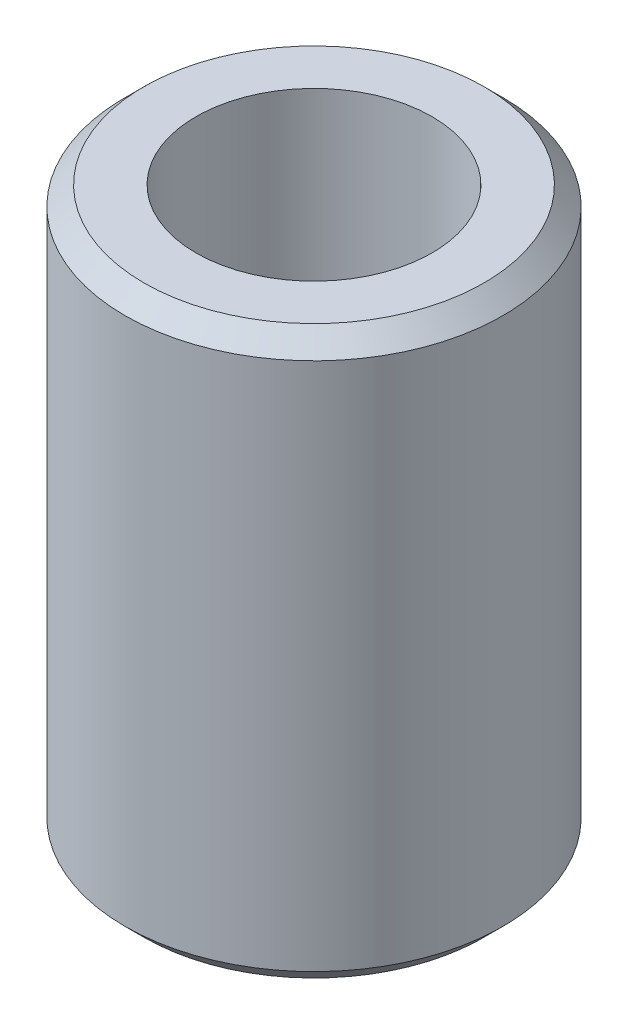
ISO-10303-21;
HEADER;
FILE_DESCRIPTION(('STEP AP214'),'2;1');
FILE_NAME('part.step','',(''),(''),'','','');
FILE_SCHEMA(('AUTOMOTIVE_DESIGN { 1 0 10303 214 1 1 1 1 }'));
ENDSEC;
DATA;
#1=APPLICATION_CONTEXT('core data for automotive mechanical design processes');
#2=APPLICATION_PROTOCOL_DEFINITION('international standard','automotive_design',2000,#1);
#3=PRODUCT_CONTEXT('',#1,'mechanical');
#4=PRODUCT('Part','Part','',(#3));
#5=PRODUCT_RELATED_PRODUCT_CATEGORY('part','',(#4));
#6=PRODUCT_DEFINITION_FORMATION('','',#4);
#7=PRODUCT_DEFINITION_CONTEXT('part definition',#1,'design');
#8=PRODUCT_DEFINITION('design','',#6,#7);
#9=PRODUCT_DEFINITION_SHAPE('','',#8);
#10=(LENGTH_UNIT() NAMED_UNIT(*) SI_UNIT(.MILLI.,.METRE.));
#11=(NAMED_UNIT(*) PLANE_ANGLE_UNIT() SI_UNIT($,.RADIAN.));
#12=(NAMED_UNIT(*) SI_UNIT($,.STERADIAN.) SOLID_ANGLE_UNIT());
#13=UNCERTAINTY_MEASURE_WITH_UNIT(LENGTH_MEASURE(1.E-05),#10,'distance_accuracy_value','');
#14=(GEOMETRIC_REPRESENTATION_CONTEXT(3) GLOBAL_UNCERTAINTY_ASSIGNED_CONTEXT((#13)) GLOBAL_UNIT_ASSIGNED_CONTEXT((#10,
#11,#12)) REPRESENTATION_CONTEXT('',''));
#15=CARTESIAN_POINT('',(0.,0.,0.));
#16=DIRECTION('',(0.,0.,1.));
#17=DIRECTION('',(1.,0.,0.));
#18=AXIS2_PLACEMENT_3D('',#15,#16,#17);
#19=CARTESIAN_POINT('',(0.,30.,0.));
#20=DIRECTION('',(0.,1.,0.));
#21=DIRECTION('',(0.,0.,1.));
#22=AXIS2_PLACEMENT_3D('',#19,#20,#21);
#23=PLANE('',#22);
#24=CARTESIAN_POINT('',(0.,30.,0.));
#25=DIRECTION('',(0.,1.,0.));
#26=DIRECTION('',(0.,0.,1.));
#27=AXIS2_PLACEMENT_3D('',#24,#25,#26);
#28=CIRCLE('',#27,18.);
#29=CARTESIAN_POINT('',(0.,30.,18.));
#30=VERTEX_POINT('',#29);
#31=EDGE_CURVE('E10',#30,#30,#28,.T.);
#32=ORIENTED_EDGE('',*,*,#31,.T.);
#33=EDGE_LOOP('',(#32));
#34=FACE_BOUND('',#33,.T.);
#35=CARTESIAN_POINT('',(0.,30.,0.));
#36=DIRECTION('',(0.,1.,0.));
#37=DIRECTION('',(0.,0.,1.));
#38=AXIS2_PLACEMENT_3D('',#35,#36,#37);
#39=CIRCLE('',#38,12.5);
#40=CARTESIAN_POINT('',(0.,30.,12.5));
#41=VERTEX_POINT('',#40);
#42=EDGE_CURVE('E58',#41,#41,#39,.T.);
#43=ORIENTED_EDGE('',*,*,#42,.F.);
#44=EDGE_LOOP('',(#43));
#45=FACE_BOUND('',#44,.T.);
#46=ADVANCED_FACE('F37',(#34,#45),#23,.T.);
#47=CARTESIAN_POINT('',(0.,-30.,0.));
#48=DIRECTION('',(0.,1.,0.));
#49=DIRECTION('',(0.,0.,1.));
#50=AXIS2_PLACEMENT_3D('',#47,#48,#49);
#51=PLANE('',#50);
#52=CARTESIAN_POINT('',(0.,-30.,0.));
#53=DIRECTION('',(0.,1.,0.));
#54=DIRECTION('',(0.,0.,1.));
#55=AXIS2_PLACEMENT_3D('',#52,#53,#54);
#56=CIRCLE('',#55,18.);
#57=CARTESIAN_POINT('',(0.,-30.,18.));
#58=VERTEX_POINT('',#57);
#59=EDGE_CURVE('E45',#58,#58,#56,.F.);
#60=ORIENTED_EDGE('',*,*,#59,.T.);
#61=EDGE_LOOP('',(#60));
#62=FACE_BOUND('',#61,.T.);
#63=CARTESIAN_POINT('',(0.,-30.,0.));
#64=DIRECTION('',(0.,1.,0.));
#65=DIRECTION('',(0.,0.,1.));
#66=AXIS2_PLACEMENT_3D('',#63,#64,#65);
#67=CIRCLE('',#66,12.5);
#68=CARTESIAN_POINT('',(0.,-30.,12.5));
#69=VERTEX_POINT('',#68);
#70=EDGE_CURVE('E59',#69,#69,#67,.T.);
#71=ORIENTED_EDGE('',*,*,#70,.T.);
#72=EDGE_LOOP('',(#71));
#73=FACE_BOUND('',#72,.T.);
#74=ADVANCED_FACE('F69',(#62,#73),#51,.F.);
#75=CARTESIAN_POINT('',(0.,30.,0.));
#76=DIRECTION('',(0.,-1.,0.));
#77=DIRECTION('',(0.,0.,-1.));
#78=AXIS2_PLACEMENT_3D('',#75,#76,#77);
#79=CYLINDRICAL_SURFACE('',#78,20.);
#80=CARTESIAN_POINT('',(0.,-28.,0.));
#81=DIRECTION('',(0.,1.,0.));
#82=DIRECTION('',(0.,0.,1.));
#83=AXIS2_PLACEMENT_3D('',#80,#81,#82);
#84=CIRCLE('',#83,20.);
#85=CARTESIAN_POINT('',(0.,-28.,20.));
#86=VERTEX_POINT('',#85);
#87=EDGE_CURVE('E49',#86,#86,#84,.T.);
#88=ORIENTED_EDGE('',*,*,#87,.T.);
#89=EDGE_LOOP('',(#88));
#90=FACE_BOUND('',#89,.T.);
#91=CARTESIAN_POINT('',(0.,28.,0.));
#92=DIRECTION('',(0.,1.,0.));
#93=DIRECTION('',(0.,0.,1.));
#94=AXIS2_PLACEMENT_3D('',#91,#92,#93);
#95=CIRCLE('',#94,20.);
#96=CARTESIAN_POINT('',(0.,28.,20.));
#97=VERTEX_POINT('',#96);
#98=EDGE_CURVE('E53',#97,#97,#95,.F.);
#99=ORIENTED_EDGE('',*,*,#98,.T.);
#100=EDGE_LOOP('',(#99));
#101=FACE_BOUND('',#100,.T.);
#102=ADVANCED_FACE('F74',(#90,#101),#79,.T.);
#103=CARTESIAN_POINT('',(0.,30.,0.));
#104=DIRECTION('',(0.,-1.,0.));
#105=DIRECTION('',(0.,0.,-1.));
#106=AXIS2_PLACEMENT_3D('',#103,#104,#105);
#107=CYLINDRICAL_SURFACE('',#106,12.5);
#108=ORIENTED_EDGE('',*,*,#42,.T.);
#109=EDGE_LOOP('',(#108));
#110=FACE_BOUND('',#109,.T.);
#111=ORIENTED_EDGE('',*,*,#70,.F.);
#112=EDGE_LOOP('',(#111));
#113=FACE_BOUND('',#112,.T.);
#114=ADVANCED_FACE('F65',(#110,#113),#107,.F.);
#115=CARTESIAN_POINT('',(0.,-28.,0.));
#116=DIRECTION('',(0.,1.,0.));
#117=DIRECTION('',(0.,0.,1.));
#118=AXIS2_PLACEMENT_3D('',#115,#116,#117);
#119=CONICAL_SURFACE('',#118,20.,0.785398163397451);
#120=ORIENTED_EDGE('',*,*,#59,.F.);
#121=EDGE_LOOP('',(#120));
#122=FACE_BOUND('',#121,.T.);
#123=ORIENTED_EDGE('',*,*,#87,.F.);
#124=EDGE_LOOP('',(#123));
#125=FACE_BOUND('',#124,.T.);
#126=ADVANCED_FACE('F81',(#122,#125),#119,.T.);
#127=CARTESIAN_POINT('',(0.,30.,0.));
#128=DIRECTION('',(0.,-1.,0.));
#129=DIRECTION('',(0.,0.,-1.));
#130=AXIS2_PLACEMENT_3D('',#127,#128,#129);
#131=CONICAL_SURFACE('',#130,18.,0.785398163397448);
#132=ORIENTED_EDGE('',*,*,#98,.F.);
#133=EDGE_LOOP('',(#132));
#134=FACE_BOUND('',#133,.T.);
#135=ORIENTED_EDGE('',*,*,#31,.F.);
#136=EDGE_LOOP('',(#135));
#137=FACE_BOUND('',#136,.T.);
#138=ADVANCED_FACE('F40',(#134,#137),#131,.T.);
#139=CLOSED_SHELL('',(#46,#74,#102,#114,#126,#138));
#140=MANIFOLD_SOLID_BREP('B2',#139);
#141=ADVANCED_BREP_SHAPE_REPRESENTATION('',(#18,#140),#14);
#142=SHAPE_DEFINITION_REPRESENTATION(#9,#141);
ENDSEC;
END-ISO-10303-21;
